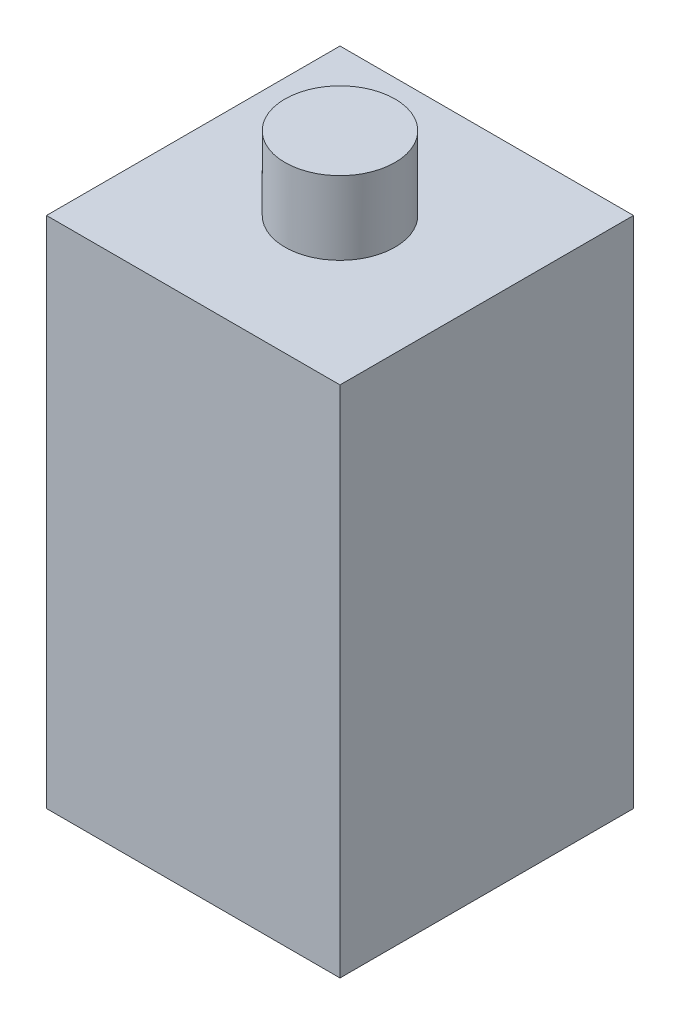
ISO-10303-21;
HEADER;
FILE_DESCRIPTION(('STEP AP214'),'2;1');
FILE_NAME('part.step','',(''),(''),'','','');
FILE_SCHEMA(('AUTOMOTIVE_DESIGN { 1 0 10303 214 1 1 1 1 }'));
ENDSEC;
DATA;
#1=APPLICATION_CONTEXT('core data for automotive mechanical design processes');
#2=APPLICATION_PROTOCOL_DEFINITION('international standard','automotive_design',2000,#1);
#3=PRODUCT_CONTEXT('',#1,'mechanical');
#4=PRODUCT('Part','Part','',(#3));
#5=PRODUCT_RELATED_PRODUCT_CATEGORY('part','',(#4));
#6=PRODUCT_DEFINITION_FORMATION('','',#4);
#7=PRODUCT_DEFINITION_CONTEXT('part definition',#1,'design');
#8=PRODUCT_DEFINITION('design','',#6,#7);
#9=PRODUCT_DEFINITION_SHAPE('','',#8);
#10=(LENGTH_UNIT() NAMED_UNIT(*) SI_UNIT(.MILLI.,.METRE.));
#11=(NAMED_UNIT(*) PLANE_ANGLE_UNIT() SI_UNIT($,.RADIAN.));
#12=(NAMED_UNIT(*) SI_UNIT($,.STERADIAN.) SOLID_ANGLE_UNIT());
#13=UNCERTAINTY_MEASURE_WITH_UNIT(LENGTH_MEASURE(1.E-05),#10,'distance_accuracy_value','');
#14=(GEOMETRIC_REPRESENTATION_CONTEXT(3) GLOBAL_UNCERTAINTY_ASSIGNED_CONTEXT((#13)) GLOBAL_UNIT_ASSIGNED_CONTEXT((#10,
#11,#12)) REPRESENTATION_CONTEXT('',''));
#15=CARTESIAN_POINT('',(0.,0.,0.));
#16=DIRECTION('',(0.,0.,1.));
#17=DIRECTION('',(1.,0.,0.));
#18=AXIS2_PLACEMENT_3D('',#15,#16,#17);
#19=CARTESIAN_POINT('',(0.,5.,0.));
#20=DIRECTION('',(0.,-1.,0.));
#21=DIRECTION('',(0.,0.,-1.));
#22=AXIS2_PLACEMENT_3D('',#19,#20,#21);
#23=CYLINDRICAL_SURFACE('',#22,3.75);
#24=CARTESIAN_POINT('',(0.,5.,0.));
#25=DIRECTION('',(0.,1.,0.));
#26=DIRECTION('',(0.,0.,1.));
#27=AXIS2_PLACEMENT_3D('',#24,#25,#26);
#28=CIRCLE('',#27,3.75);
#29=CARTESIAN_POINT('',(0.,5.,3.75));
#30=VERTEX_POINT('',#29);
#31=EDGE_CURVE('E11',#30,#30,#28,.T.);
#32=ORIENTED_EDGE('',*,*,#31,.F.);
#33=EDGE_LOOP('',(#32));
#34=FACE_BOUND('',#33,.T.);
#35=CARTESIAN_POINT('',(0.,0.,0.));
#36=DIRECTION('',(0.,-1.,0.));
#37=DIRECTION('',(0.,0.,-1.));
#38=AXIS2_PLACEMENT_3D('',#35,#36,#37);
#39=CIRCLE('',#38,3.75);
#40=CARTESIAN_POINT('',(0.,0.,-3.75));
#41=VERTEX_POINT('',#40);
#42=EDGE_CURVE('E41',#41,#41,#39,.T.);
#43=ORIENTED_EDGE('',*,*,#42,.F.);
#44=EDGE_LOOP('',(#43));
#45=FACE_BOUND('',#44,.T.);
#46=ADVANCED_FACE('F33',(#34,#45),#23,.T.);
#47=CARTESIAN_POINT('',(0.,5.,0.));
#48=DIRECTION('',(0.,1.,0.));
#49=DIRECTION('',(0.,0.,1.));
#50=AXIS2_PLACEMENT_3D('',#47,#48,#49);
#51=PLANE('',#50);
#52=ORIENTED_EDGE('',*,*,#31,.T.);
#53=EDGE_LOOP('',(#52));
#54=FACE_BOUND('',#53,.T.);
#55=ADVANCED_FACE('F117',(#54),#51,.T.);
#56=CARTESIAN_POINT('',(10.,-35.,10.));
#57=DIRECTION('',(1.,0.,0.));
#58=DIRECTION('',(0.,0.,-1.));
#59=AXIS2_PLACEMENT_3D('',#56,#57,#58);
#60=PLANE('',#59);
#61=DIRECTION('',(0.,0.,-1.));
#62=VECTOR('',#61,1.);
#63=CARTESIAN_POINT('',(10.,0.,10.));
#64=LINE('',#63,#62);
#65=CARTESIAN_POINT('',(10.,0.,10.));
#66=VERTEX_POINT('',#65);
#67=CARTESIAN_POINT('',(10.,0.,-10.));
#68=VERTEX_POINT('',#67);
#69=EDGE_CURVE('E100',#66,#68,#64,.T.);
#70=ORIENTED_EDGE('',*,*,#69,.F.);
#71=DIRECTION('',(0.,1.,0.));
#72=VECTOR('',#71,1.);
#73=CARTESIAN_POINT('',(10.,-35.,10.));
#74=LINE('',#73,#72);
#75=CARTESIAN_POINT('',(10.,-35.,10.));
#76=VERTEX_POINT('',#75);
#77=EDGE_CURVE('E49',#76,#66,#74,.T.);
#78=ORIENTED_EDGE('',*,*,#77,.F.);
#79=DIRECTION('',(0.,0.,-1.));
#80=VECTOR('',#79,1.);
#81=CARTESIAN_POINT('',(10.,-35.,10.));
#82=LINE('',#81,#80);
#83=CARTESIAN_POINT('',(10.,-35.,-10.));
#84=VERTEX_POINT('',#83);
#85=EDGE_CURVE('E94',#76,#84,#82,.T.);
#86=ORIENTED_EDGE('',*,*,#85,.T.);
#87=DIRECTION('',(0.,1.,0.));
#88=VECTOR('',#87,1.);
#89=CARTESIAN_POINT('',(10.,-35.,-10.));
#90=LINE('',#89,#88);
#91=EDGE_CURVE('E77',#84,#68,#90,.T.);
#92=ORIENTED_EDGE('',*,*,#91,.T.);
#93=EDGE_LOOP('',(#70,#78,#86,#92));
#94=FACE_BOUND('',#93,.T.);
#95=ADVANCED_FACE('F122',(#94),#60,.T.);
#96=CARTESIAN_POINT('',(-10.,-35.,10.));
#97=DIRECTION('',(0.,0.,1.));
#98=DIRECTION('',(1.,0.,0.));
#99=AXIS2_PLACEMENT_3D('',#96,#97,#98);
#100=PLANE('',#99);
#101=DIRECTION('',(1.,0.,0.));
#102=VECTOR('',#101,1.);
#103=CARTESIAN_POINT('',(-10.,0.,10.));
#104=LINE('',#103,#102);
#105=CARTESIAN_POINT('',(-10.,0.,10.));
#106=VERTEX_POINT('',#105);
#107=EDGE_CURVE('E96',#106,#66,#104,.T.);
#108=ORIENTED_EDGE('',*,*,#107,.F.);
#109=DIRECTION('',(0.,1.,0.));
#110=VECTOR('',#109,1.);
#111=CARTESIAN_POINT('',(-10.,-35.,10.));
#112=LINE('',#111,#110);
#113=CARTESIAN_POINT('',(-10.,-35.,10.));
#114=VERTEX_POINT('',#113);
#115=EDGE_CURVE('E66',#114,#106,#112,.T.);
#116=ORIENTED_EDGE('',*,*,#115,.F.);
#117=DIRECTION('',(1.,0.,0.));
#118=VECTOR('',#117,1.);
#119=CARTESIAN_POINT('',(-10.,-35.,10.));
#120=LINE('',#119,#118);
#121=EDGE_CURVE('E91',#114,#76,#120,.T.);
#122=ORIENTED_EDGE('',*,*,#121,.T.);
#123=ORIENTED_EDGE('',*,*,#77,.T.);
#124=EDGE_LOOP('',(#108,#116,#122,#123));
#125=FACE_BOUND('',#124,.T.);
#126=ADVANCED_FACE('F128',(#125),#100,.T.);
#127=CARTESIAN_POINT('',(-10.,-35.,10.));
#128=DIRECTION('',(-1.,0.,0.));
#129=DIRECTION('',(0.,0.,1.));
#130=AXIS2_PLACEMENT_3D('',#127,#128,#129);
#131=PLANE('',#130);
#132=DIRECTION('',(0.,0.,1.));
#133=VECTOR('',#132,1.);
#134=CARTESIAN_POINT('',(-10.,0.,10.));
#135=LINE('',#134,#133);
#136=CARTESIAN_POINT('',(-10.,0.,-10.));
#137=VERTEX_POINT('',#136);
#138=EDGE_CURVE('E85',#137,#106,#135,.T.);
#139=ORIENTED_EDGE('',*,*,#138,.F.);
#140=DIRECTION('',(0.,1.,0.));
#141=VECTOR('',#140,1.);
#142=CARTESIAN_POINT('',(-10.,-35.,-10.));
#143=LINE('',#142,#141);
#144=CARTESIAN_POINT('',(-10.,-35.,-10.));
#145=VERTEX_POINT('',#144);
#146=EDGE_CURVE('E80',#145,#137,#143,.T.);
#147=ORIENTED_EDGE('',*,*,#146,.F.);
#148=DIRECTION('',(0.,0.,1.));
#149=VECTOR('',#148,1.);
#150=CARTESIAN_POINT('',(-10.,-35.,10.));
#151=LINE('',#150,#149);
#152=EDGE_CURVE('E83',#145,#114,#151,.T.);
#153=ORIENTED_EDGE('',*,*,#152,.T.);
#154=ORIENTED_EDGE('',*,*,#115,.T.);
#155=EDGE_LOOP('',(#139,#147,#153,#154));
#156=FACE_BOUND('',#155,.T.);
#157=ADVANCED_FACE('F82',(#156),#131,.T.);
#158=CARTESIAN_POINT('',(-10.,-35.,-10.));
#159=DIRECTION('',(0.,0.,-1.));
#160=DIRECTION('',(-1.,0.,0.));
#161=AXIS2_PLACEMENT_3D('',#158,#159,#160);
#162=PLANE('',#161);
#163=DIRECTION('',(-1.,0.,0.));
#164=VECTOR('',#163,1.);
#165=CARTESIAN_POINT('',(-10.,0.,-10.));
#166=LINE('',#165,#164);
#167=EDGE_CURVE('E103',#68,#137,#166,.T.);
#168=ORIENTED_EDGE('',*,*,#167,.F.);
#169=ORIENTED_EDGE('',*,*,#91,.F.);
#170=DIRECTION('',(-1.,0.,0.));
#171=VECTOR('',#170,1.);
#172=CARTESIAN_POINT('',(-10.,-35.,-10.));
#173=LINE('',#172,#171);
#174=EDGE_CURVE('E90',#84,#145,#173,.T.);
#175=ORIENTED_EDGE('',*,*,#174,.T.);
#176=ORIENTED_EDGE('',*,*,#146,.T.);
#177=EDGE_LOOP('',(#168,#169,#175,#176));
#178=FACE_BOUND('',#177,.T.);
#179=ADVANCED_FACE('F93',(#178),#162,.T.);
#180=CARTESIAN_POINT('',(0.,-35.,0.));
#181=DIRECTION('',(0.,-1.,0.));
#182=DIRECTION('',(0.,0.,-1.));
#183=AXIS2_PLACEMENT_3D('',#180,#181,#182);
#184=PLANE('',#183);
#185=ORIENTED_EDGE('',*,*,#85,.F.);
#186=ORIENTED_EDGE('',*,*,#121,.F.);
#187=ORIENTED_EDGE('',*,*,#152,.F.);
#188=ORIENTED_EDGE('',*,*,#174,.F.);
#189=EDGE_LOOP('',(#185,#186,#187,#188));
#190=FACE_BOUND('',#189,.T.);
#191=ADVANCED_FACE('F89',(#190),#184,.T.);
#192=CARTESIAN_POINT('',(0.,0.,0.));
#193=DIRECTION('',(0.,-1.,0.));
#194=DIRECTION('',(0.,0.,-1.));
#195=AXIS2_PLACEMENT_3D('',#192,#193,#194);
#196=PLANE('',#195);
#197=ORIENTED_EDGE('',*,*,#42,.T.);
#198=EDGE_LOOP('',(#197));
#199=FACE_BOUND('',#198,.T.);
#200=ORIENTED_EDGE('',*,*,#69,.T.);
#201=ORIENTED_EDGE('',*,*,#167,.T.);
#202=ORIENTED_EDGE('',*,*,#138,.T.);
#203=ORIENTED_EDGE('',*,*,#107,.T.);
#204=EDGE_LOOP('',(#200,#201,#202,#203));
#205=FACE_BOUND('',#204,.T.);
#206=ADVANCED_FACE('F113',(#199,#205),#196,.F.);
#207=CLOSED_SHELL('',(#46,#55,#95,#126,#157,#179,#191,#206));
#208=MANIFOLD_SOLID_BREP('B2',#207);
#209=ADVANCED_BREP_SHAPE_REPRESENTATION('',(#18,#208),#14);
#210=SHAPE_DEFINITION_REPRESENTATION(#9,#209);
ENDSEC;
END-ISO-10303-21;
